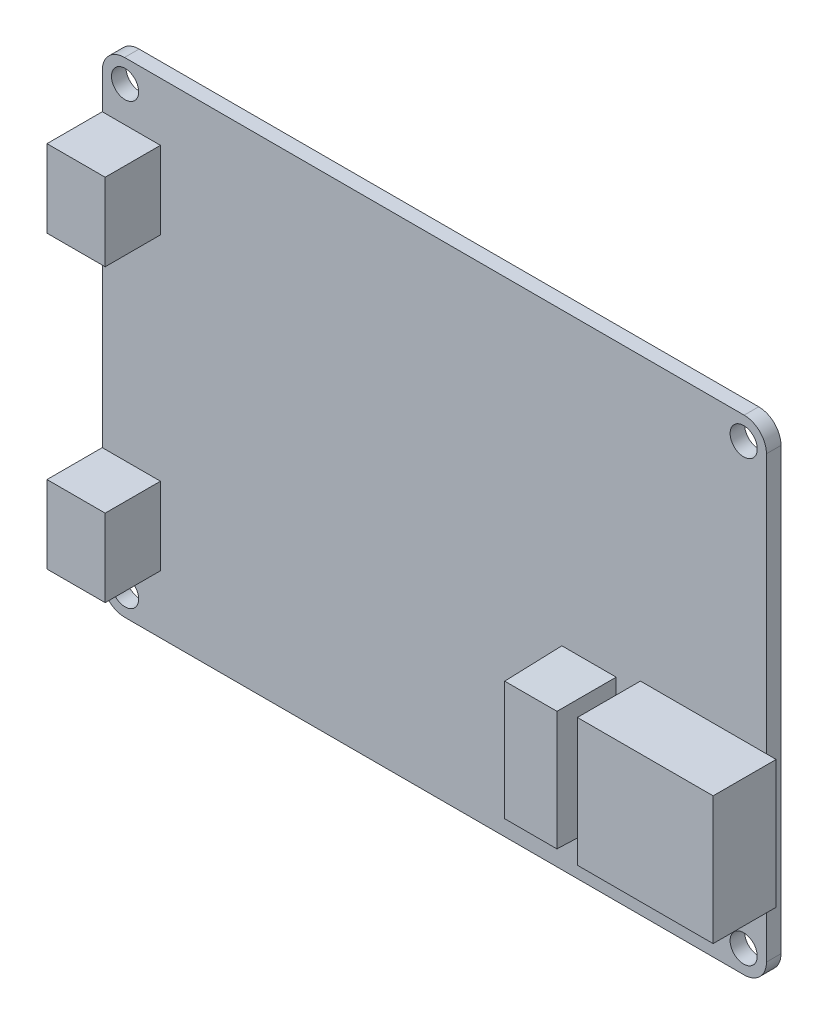
ISO-10303-21;
HEADER;
FILE_DESCRIPTION(('STEP AP214'),'2;1');
FILE_NAME('part.step','',(''),(''),'','','');
FILE_SCHEMA(('AUTOMOTIVE_DESIGN { 1 0 10303 214 1 1 1 1 }'));
ENDSEC;
DATA;
#1=APPLICATION_CONTEXT('core data for automotive mechanical design processes');
#2=APPLICATION_PROTOCOL_DEFINITION('international standard','automotive_design',2000,#1);
#3=PRODUCT_CONTEXT('',#1,'mechanical');
#4=PRODUCT('Part','Part','',(#3));
#5=PRODUCT_RELATED_PRODUCT_CATEGORY('part','',(#4));
#6=PRODUCT_DEFINITION_FORMATION('','',#4);
#7=PRODUCT_DEFINITION_CONTEXT('part definition',#1,'design');
#8=PRODUCT_DEFINITION('design','',#6,#7);
#9=PRODUCT_DEFINITION_SHAPE('','',#8);
#10=(LENGTH_UNIT() NAMED_UNIT(*) SI_UNIT(.MILLI.,.METRE.));
#11=(NAMED_UNIT(*) PLANE_ANGLE_UNIT() SI_UNIT($,.RADIAN.));
#12=(NAMED_UNIT(*) SI_UNIT($,.STERADIAN.) SOLID_ANGLE_UNIT());
#13=UNCERTAINTY_MEASURE_WITH_UNIT(LENGTH_MEASURE(1.E-05),#10,'distance_accuracy_value','');
#14=(GEOMETRIC_REPRESENTATION_CONTEXT(3) GLOBAL_UNCERTAINTY_ASSIGNED_CONTEXT((#13)) GLOBAL_UNIT_ASSIGNED_CONTEXT((#10,
#11,#12)) REPRESENTATION_CONTEXT('',''));
#15=CARTESIAN_POINT('',(0.,0.,0.));
#16=DIRECTION('',(0.,0.,1.));
#17=DIRECTION('',(1.,0.,0.));
#18=AXIS2_PLACEMENT_3D('',#15,#16,#17);
#19=CARTESIAN_POINT('',(25.8892585779876,78.6434602513933,1.5));
#20=DIRECTION('',(0.,0.,1.));
#21=DIRECTION('',(1.,0.,0.));
#22=AXIS2_PLACEMENT_3D('',#19,#20,#21);
#23=PLANE('',#22);
#24=CARTESIAN_POINT('',(89.7392585779876,33.2934602513933,1.5));
#25=DIRECTION('',(0.,0.,1.));
#26=DIRECTION('',(1.,0.,0.));
#27=AXIS2_PLACEMENT_3D('',#24,#25,#26);
#28=CIRCLE('',#27,1.4);
#29=CARTESIAN_POINT('',(91.1392585779876,33.2934602513933,1.5));
#30=VERTEX_POINT('',#29);
#31=EDGE_CURVE('E325',#30,#30,#28,.T.);
#32=ORIENTED_EDGE('',*,*,#31,.F.);
#33=EDGE_LOOP('',(#32));
#34=FACE_BOUND('',#33,.T.);
#35=CARTESIAN_POINT('',(25.9392585779876,78.5934602513933,1.5));
#36=DIRECTION('',(0.,0.,1.));
#37=DIRECTION('',(1.,0.,0.));
#38=AXIS2_PLACEMENT_3D('',#35,#36,#37);
#39=CIRCLE('',#38,1.4);
#40=CARTESIAN_POINT('',(27.3392585779876,78.5934602513933,1.5));
#41=VERTEX_POINT('',#40);
#42=EDGE_CURVE('E337',#41,#41,#39,.T.);
#43=ORIENTED_EDGE('',*,*,#42,.F.);
#44=EDGE_LOOP('',(#43));
#45=FACE_BOUND('',#44,.T.);
#46=CARTESIAN_POINT('',(25.9392585779876,33.2934602513933,1.5));
#47=DIRECTION('',(0.,0.,1.));
#48=DIRECTION('',(1.,0.,0.));
#49=AXIS2_PLACEMENT_3D('',#46,#47,#48);
#50=CIRCLE('',#49,1.4);
#51=CARTESIAN_POINT('',(27.3392585779876,33.2934602513933,1.5));
#52=VERTEX_POINT('',#51);
#53=EDGE_CURVE('E331',#52,#52,#50,.T.);
#54=ORIENTED_EDGE('',*,*,#53,.F.);
#55=EDGE_LOOP('',(#54));
#56=FACE_BOUND('',#55,.T.);
#57=CARTESIAN_POINT('',(89.7392585779876,78.5934602513933,1.5));
#58=DIRECTION('',(0.,0.,1.));
#59=DIRECTION('',(1.,0.,0.));
#60=AXIS2_PLACEMENT_3D('',#57,#58,#59);
#61=CIRCLE('',#60,1.4);
#62=CARTESIAN_POINT('',(91.1392585779876,78.5934602513933,1.5));
#63=VERTEX_POINT('',#62);
#64=EDGE_CURVE('E319',#63,#63,#61,.T.);
#65=ORIENTED_EDGE('',*,*,#64,.F.);
#66=EDGE_LOOP('',(#65));
#67=FACE_BOUND('',#66,.T.);
#68=DIRECTION('',(-1.,0.,0.));
#69=VECTOR('',#68,1.);
#70=CARTESIAN_POINT('',(76.5892585779876,50.9434602513933,1.5));
#71=LINE('',#70,#69);
#72=CARTESIAN_POINT('',(76.5892585779876,50.9434602513933,1.5));
#73=VERTEX_POINT('',#72);
#74=CARTESIAN_POINT('',(70.9892585779876,50.9434602513933,1.5));
#75=VERTEX_POINT('',#74);
#76=EDGE_CURVE('E261',#73,#75,#71,.T.);
#77=ORIENTED_EDGE('',*,*,#76,.F.);
#78=DIRECTION('',(0.,1.,0.));
#79=VECTOR('',#78,1.);
#80=CARTESIAN_POINT('',(76.5892585779876,50.9434602513933,1.5));
#81=LINE('',#80,#79);
#82=CARTESIAN_POINT('',(76.5892585779876,38.4434602513933,1.5));
#83=VERTEX_POINT('',#82);
#84=EDGE_CURVE('E258',#83,#73,#81,.T.);
#85=ORIENTED_EDGE('',*,*,#84,.F.);
#86=DIRECTION('',(1.,0.,0.));
#87=VECTOR('',#86,1.);
#88=CARTESIAN_POINT('',(76.5892585779876,38.4434602513933,1.5));
#89=LINE('',#88,#87);
#90=CARTESIAN_POINT('',(70.9892585779875,38.4434602513933,1.5));
#91=VERTEX_POINT('',#90);
#92=EDGE_CURVE('E266',#91,#83,#89,.T.);
#93=ORIENTED_EDGE('',*,*,#92,.F.);
#94=DIRECTION('',(0.,-1.,0.));
#95=VECTOR('',#94,1.);
#96=CARTESIAN_POINT('',(70.9892585779876,50.9434602513933,1.5));
#97=LINE('',#96,#95);
#98=EDGE_CURVE('E263',#75,#91,#97,.T.);
#99=ORIENTED_EDGE('',*,*,#98,.F.);
#100=EDGE_LOOP('',(#77,#85,#93,#99));
#101=FACE_BOUND('',#100,.T.);
#102=DIRECTION('',(0.,1.,0.));
#103=VECTOR('',#102,1.);
#104=CARTESIAN_POINT('',(29.5892585779876,44.9434602513933,1.5));
#105=LINE('',#104,#103);
#106=CARTESIAN_POINT('',(29.5892585779876,36.9434602513933,1.5));
#107=VERTEX_POINT('',#106);
#108=CARTESIAN_POINT('',(29.5892585779876,44.9434602513933,1.5));
#109=VERTEX_POINT('',#108);
#110=EDGE_CURVE('E49',#107,#109,#105,.T.);
#111=ORIENTED_EDGE('',*,*,#110,.F.);
#112=DIRECTION('',(1.,0.,0.));
#113=VECTOR('',#112,1.);
#114=CARTESIAN_POINT('',(23.5892585779876,36.9434602513933,1.5));
#115=LINE('',#114,#113);
#116=CARTESIAN_POINT('',(23.5892585779876,36.9434602513933,1.5));
#117=VERTEX_POINT('',#116);
#118=EDGE_CURVE('E422',#117,#107,#115,.T.);
#119=ORIENTED_EDGE('',*,*,#118,.F.);
#120=DIRECTION('',(0.,-1.,0.));
#121=VECTOR('',#120,1.);
#122=CARTESIAN_POINT('',(23.5892585779876,78.6434602513933,1.5));
#123=LINE('',#122,#121);
#124=CARTESIAN_POINT('',(23.5892585779876,33.2434602513933,1.5));
#125=VERTEX_POINT('',#124);
#126=EDGE_CURVE('E222',#117,#125,#123,.T.);
#127=ORIENTED_EDGE('',*,*,#126,.T.);
#128=CARTESIAN_POINT('',(25.8892585779876,33.2434602513933,1.5));
#129=DIRECTION('',(0.,0.,1.));
#130=DIRECTION('',(1.,0.,0.));
#131=AXIS2_PLACEMENT_3D('',#128,#129,#130);
#132=CIRCLE('',#131,2.3);
#133=CARTESIAN_POINT('',(25.8892585779876,30.9434602513933,1.5));
#134=VERTEX_POINT('',#133);
#135=EDGE_CURVE('E349',#125,#134,#132,.T.);
#136=ORIENTED_EDGE('',*,*,#135,.T.);
#137=DIRECTION('',(1.,0.,0.));
#138=VECTOR('',#137,1.);
#139=CARTESIAN_POINT('',(25.8892585779876,30.9434602513933,1.5));
#140=LINE('',#139,#138);
#141=CARTESIAN_POINT('',(89.7892585779876,30.9434602513933,1.5));
#142=VERTEX_POINT('',#141);
#143=EDGE_CURVE('E352',#134,#142,#140,.T.);
#144=ORIENTED_EDGE('',*,*,#143,.T.);
#145=CARTESIAN_POINT('',(89.7892585779876,33.2434602513933,1.5));
#146=DIRECTION('',(0.,0.,1.));
#147=DIRECTION('',(1.,0.,0.));
#148=AXIS2_PLACEMENT_3D('',#145,#146,#147);
#149=CIRCLE('',#148,2.3);
#150=CARTESIAN_POINT('',(92.0892585779876,33.2434602513933,1.5));
#151=VERTEX_POINT('',#150);
#152=EDGE_CURVE('E354',#142,#151,#149,.T.);
#153=ORIENTED_EDGE('',*,*,#152,.T.);
#154=DIRECTION('',(0.,1.,0.));
#155=VECTOR('',#154,1.);
#156=CARTESIAN_POINT('',(92.0892585779876,78.6434602513933,1.5));
#157=LINE('',#156,#155);
#158=CARTESIAN_POINT('',(92.0892585779876,38.6434602513933,1.5));
#159=VERTEX_POINT('',#158);
#160=EDGE_CURVE('E357',#151,#159,#157,.T.);
#161=ORIENTED_EDGE('',*,*,#160,.T.);
#162=DIRECTION('',(1.,0.,0.));
#163=VECTOR('',#162,1.);
#164=CARTESIAN_POINT('',(79.0892585779876,38.6434602513933,1.5));
#165=LINE('',#164,#163);
#166=CARTESIAN_POINT('',(79.0892585779876,38.6434602513933,1.5));
#167=VERTEX_POINT('',#166);
#168=EDGE_CURVE('E301',#167,#159,#165,.T.);
#169=ORIENTED_EDGE('',*,*,#168,.F.);
#170=DIRECTION('',(0.,-1.,0.));
#171=VECTOR('',#170,1.);
#172=CARTESIAN_POINT('',(79.0892585779876,51.8434602513933,1.5));
#173=LINE('',#172,#171);
#174=CARTESIAN_POINT('',(79.0892585779876,51.8434602513933,1.5));
#175=VERTEX_POINT('',#174);
#176=EDGE_CURVE('E271',#175,#167,#173,.T.);
#177=ORIENTED_EDGE('',*,*,#176,.F.);
#178=DIRECTION('',(-1.,0.,0.));
#179=VECTOR('',#178,1.);
#180=CARTESIAN_POINT('',(79.0892585779876,51.8434602513933,1.5));
#181=LINE('',#180,#179);
#182=CARTESIAN_POINT('',(92.0892585779876,51.8434602513933,1.5));
#183=VERTEX_POINT('',#182);
#184=EDGE_CURVE('E11',#183,#175,#181,.T.);
#185=ORIENTED_EDGE('',*,*,#184,.F.);
#186=CARTESIAN_POINT('',(92.0892585779876,78.6434602513933,1.5));
#187=VERTEX_POINT('',#186);
#188=EDGE_CURVE('E356',#183,#187,#157,.T.);
#189=ORIENTED_EDGE('',*,*,#188,.T.);
#190=CARTESIAN_POINT('',(89.7892585779876,78.6434602513933,1.5));
#191=DIRECTION('',(0.,0.,1.));
#192=DIRECTION('',(-1.,0.,0.));
#193=AXIS2_PLACEMENT_3D('',#190,#191,#192);
#194=CIRCLE('',#193,2.3);
#195=CARTESIAN_POINT('',(89.7892585779876,80.9434602513933,1.5));
#196=VERTEX_POINT('',#195);
#197=EDGE_CURVE('E359',#187,#196,#194,.T.);
#198=ORIENTED_EDGE('',*,*,#197,.T.);
#199=DIRECTION('',(-1.,0.,0.));
#200=VECTOR('',#199,1.);
#201=CARTESIAN_POINT('',(25.8892585779876,80.9434602513933,1.5));
#202=LINE('',#201,#200);
#203=CARTESIAN_POINT('',(25.8892585779876,80.9434602513933,1.5));
#204=VERTEX_POINT('',#203);
#205=EDGE_CURVE('E362',#196,#204,#202,.T.);
#206=ORIENTED_EDGE('',*,*,#205,.T.);
#207=CARTESIAN_POINT('',(25.8892585779876,78.6434602513933,1.5));
#208=DIRECTION('',(0.,0.,1.));
#209=DIRECTION('',(1.,0.,0.));
#210=AXIS2_PLACEMENT_3D('',#207,#208,#209);
#211=CIRCLE('',#210,2.3);
#212=CARTESIAN_POINT('',(23.5892585779876,78.6434602513933,1.5));
#213=VERTEX_POINT('',#212);
#214=EDGE_CURVE('E343',#204,#213,#211,.T.);
#215=ORIENTED_EDGE('',*,*,#214,.T.);
#216=CARTESIAN_POINT('',(23.5892585779876,74.9434602513933,1.5));
#217=VERTEX_POINT('',#216);
#218=EDGE_CURVE('E347',#213,#217,#123,.T.);
#219=ORIENTED_EDGE('',*,*,#218,.T.);
#220=DIRECTION('',(-1.,0.,0.));
#221=VECTOR('',#220,1.);
#222=CARTESIAN_POINT('',(23.5892585779876,74.9434602513933,1.5));
#223=LINE('',#222,#221);
#224=CARTESIAN_POINT('',(29.5892585779876,74.9434602513933,1.5));
#225=VERTEX_POINT('',#224);
#226=EDGE_CURVE('E236',#225,#217,#223,.T.);
#227=ORIENTED_EDGE('',*,*,#226,.F.);
#228=DIRECTION('',(0.,1.,0.));
#229=VECTOR('',#228,1.);
#230=CARTESIAN_POINT('',(29.5892585779876,74.9434602513933,1.5));
#231=LINE('',#230,#229);
#232=CARTESIAN_POINT('',(29.5892585779876,66.9434602513933,1.5));
#233=VERTEX_POINT('',#232);
#234=EDGE_CURVE('E226',#233,#225,#231,.T.);
#235=ORIENTED_EDGE('',*,*,#234,.F.);
#236=DIRECTION('',(1.,0.,0.));
#237=VECTOR('',#236,1.);
#238=CARTESIAN_POINT('',(23.5892585779876,66.9434602513933,1.5));
#239=LINE('',#238,#237);
#240=CARTESIAN_POINT('',(23.5892585779876,66.9434602513933,1.5));
#241=VERTEX_POINT('',#240);
#242=EDGE_CURVE('E223',#241,#233,#239,.T.);
#243=ORIENTED_EDGE('',*,*,#242,.F.);
#244=CARTESIAN_POINT('',(23.5892585779876,44.9434602513933,1.5));
#245=VERTEX_POINT('',#244);
#246=EDGE_CURVE('E350',#241,#245,#123,.T.);
#247=ORIENTED_EDGE('',*,*,#246,.T.);
#248=DIRECTION('',(-1.,0.,0.));
#249=VECTOR('',#248,1.);
#250=CARTESIAN_POINT('',(23.5892585779876,44.9434602513933,1.5));
#251=LINE('',#250,#249);
#252=EDGE_CURVE('E54',#109,#245,#251,.T.);
#253=ORIENTED_EDGE('',*,*,#252,.F.);
#254=EDGE_LOOP('',(#111,#119,#127,#136,#144,#153,#161,#169,#177,#185,#189,#198,#206,#215,#219,
#227,#235,#243,#247,#253));
#255=FACE_BOUND('',#254,.T.);
#256=ADVANCED_FACE('F32',(#34,#45,#56,#67,#101,#255),#23,.T.);
#257=CARTESIAN_POINT('',(25.8892585779876,78.6434602513933,0.));
#258=DIRECTION('',(0.,0.,1.));
#259=DIRECTION('',(1.,0.,0.));
#260=AXIS2_PLACEMENT_3D('',#257,#258,#259);
#261=PLANE('',#260);
#262=CARTESIAN_POINT('',(25.8892585779876,78.6434602513933,0.));
#263=DIRECTION('',(0.,0.,1.));
#264=DIRECTION('',(1.,0.,0.));
#265=AXIS2_PLACEMENT_3D('',#262,#263,#264);
#266=CIRCLE('',#265,2.3);
#267=CARTESIAN_POINT('',(25.8892585779876,80.9434602513933,0.));
#268=VERTEX_POINT('',#267);
#269=CARTESIAN_POINT('',(23.5892585779876,78.6434602513933,0.));
#270=VERTEX_POINT('',#269);
#271=EDGE_CURVE('E340',#268,#270,#266,.T.);
#272=ORIENTED_EDGE('',*,*,#271,.F.);
#273=DIRECTION('',(-1.,0.,0.));
#274=VECTOR('',#273,1.);
#275=CARTESIAN_POINT('',(25.8892585779876,80.9434602513933,0.));
#276=LINE('',#275,#274);
#277=CARTESIAN_POINT('',(89.7892585779876,80.9434602513933,0.));
#278=VERTEX_POINT('',#277);
#279=EDGE_CURVE('E346',#278,#268,#276,.T.);
#280=ORIENTED_EDGE('',*,*,#279,.F.);
#281=CARTESIAN_POINT('',(89.7892585779876,78.6434602513933,0.));
#282=DIRECTION('',(0.,0.,1.));
#283=DIRECTION('',(-1.,0.,0.));
#284=AXIS2_PLACEMENT_3D('',#281,#282,#283);
#285=CIRCLE('',#284,2.3);
#286=CARTESIAN_POINT('',(92.0892585779876,78.6434602513933,0.));
#287=VERTEX_POINT('',#286);
#288=EDGE_CURVE('E377',#287,#278,#285,.T.);
#289=ORIENTED_EDGE('',*,*,#288,.F.);
#290=DIRECTION('',(0.,1.,0.));
#291=VECTOR('',#290,1.);
#292=CARTESIAN_POINT('',(92.0892585779876,78.6434602513933,0.));
#293=LINE('',#292,#291);
#294=CARTESIAN_POINT('',(92.0892585779876,33.2434602513933,0.));
#295=VERTEX_POINT('',#294);
#296=EDGE_CURVE('E375',#295,#287,#293,.T.);
#297=ORIENTED_EDGE('',*,*,#296,.F.);
#298=CARTESIAN_POINT('',(89.7892585779876,33.2434602513933,0.));
#299=DIRECTION('',(0.,0.,1.));
#300=DIRECTION('',(1.,0.,0.));
#301=AXIS2_PLACEMENT_3D('',#298,#299,#300);
#302=CIRCLE('',#301,2.3);
#303=CARTESIAN_POINT('',(89.7892585779876,30.9434602513933,0.));
#304=VERTEX_POINT('',#303);
#305=EDGE_CURVE('E373',#304,#295,#302,.T.);
#306=ORIENTED_EDGE('',*,*,#305,.F.);
#307=DIRECTION('',(1.,0.,0.));
#308=VECTOR('',#307,1.);
#309=CARTESIAN_POINT('',(25.8892585779876,30.9434602513933,0.));
#310=LINE('',#309,#308);
#311=CARTESIAN_POINT('',(25.8892585779876,30.9434602513933,0.));
#312=VERTEX_POINT('',#311);
#313=EDGE_CURVE('E371',#312,#304,#310,.T.);
#314=ORIENTED_EDGE('',*,*,#313,.F.);
#315=CARTESIAN_POINT('',(25.8892585779876,33.2434602513933,0.));
#316=DIRECTION('',(0.,0.,1.));
#317=DIRECTION('',(1.,0.,0.));
#318=AXIS2_PLACEMENT_3D('',#315,#316,#317);
#319=CIRCLE('',#318,2.3);
#320=CARTESIAN_POINT('',(23.5892585779876,33.2434602513933,0.));
#321=VERTEX_POINT('',#320);
#322=EDGE_CURVE('E369',#321,#312,#319,.T.);
#323=ORIENTED_EDGE('',*,*,#322,.F.);
#324=DIRECTION('',(0.,-1.,0.));
#325=VECTOR('',#324,1.);
#326=CARTESIAN_POINT('',(23.5892585779876,78.6434602513933,0.));
#327=LINE('',#326,#325);
#328=EDGE_CURVE('E367',#270,#321,#327,.T.);
#329=ORIENTED_EDGE('',*,*,#328,.F.);
#330=EDGE_LOOP('',(#272,#280,#289,#297,#306,#314,#323,#329));
#331=FACE_BOUND('',#330,.T.);
#332=CARTESIAN_POINT('',(25.9392585779876,78.5934602513933,0.));
#333=DIRECTION('',(0.,0.,1.));
#334=DIRECTION('',(1.,0.,0.));
#335=AXIS2_PLACEMENT_3D('',#332,#333,#334);
#336=CIRCLE('',#335,1.4);
#337=CARTESIAN_POINT('',(27.3392585779876,78.5934602513933,0.));
#338=VERTEX_POINT('',#337);
#339=EDGE_CURVE('E334',#338,#338,#336,.T.);
#340=ORIENTED_EDGE('',*,*,#339,.T.);
#341=EDGE_LOOP('',(#340));
#342=FACE_BOUND('',#341,.T.);
#343=CARTESIAN_POINT('',(25.9392585779876,33.2934602513933,0.));
#344=DIRECTION('',(0.,0.,1.));
#345=DIRECTION('',(1.,0.,0.));
#346=AXIS2_PLACEMENT_3D('',#343,#344,#345);
#347=CIRCLE('',#346,1.4);
#348=CARTESIAN_POINT('',(27.3392585779876,33.2934602513933,0.));
#349=VERTEX_POINT('',#348);
#350=EDGE_CURVE('E328',#349,#349,#347,.T.);
#351=ORIENTED_EDGE('',*,*,#350,.T.);
#352=EDGE_LOOP('',(#351));
#353=FACE_BOUND('',#352,.T.);
#354=CARTESIAN_POINT('',(89.7392585779876,33.2934602513933,0.));
#355=DIRECTION('',(0.,0.,1.));
#356=DIRECTION('',(1.,0.,0.));
#357=AXIS2_PLACEMENT_3D('',#354,#355,#356);
#358=CIRCLE('',#357,1.4);
#359=CARTESIAN_POINT('',(91.1392585779876,33.2934602513933,0.));
#360=VERTEX_POINT('',#359);
#361=EDGE_CURVE('E322',#360,#360,#358,.T.);
#362=ORIENTED_EDGE('',*,*,#361,.T.);
#363=EDGE_LOOP('',(#362));
#364=FACE_BOUND('',#363,.T.);
#365=CARTESIAN_POINT('',(89.7392585779876,78.5934602513933,0.));
#366=DIRECTION('',(0.,0.,1.));
#367=DIRECTION('',(1.,0.,0.));
#368=AXIS2_PLACEMENT_3D('',#365,#366,#367);
#369=CIRCLE('',#368,1.4);
#370=CARTESIAN_POINT('',(91.1392585779876,78.5934602513933,0.));
#371=VERTEX_POINT('',#370);
#372=EDGE_CURVE('E318',#371,#371,#369,.T.);
#373=ORIENTED_EDGE('',*,*,#372,.T.);
#374=EDGE_LOOP('',(#373));
#375=FACE_BOUND('',#374,.T.);
#376=ADVANCED_FACE('F409',(#331,#342,#353,#364,#375),#261,.F.);
#377=CARTESIAN_POINT('',(25.8892585779876,78.6434602513933,1.5));
#378=DIRECTION('',(0.,0.,-1.));
#379=DIRECTION('',(-1.,0.,0.));
#380=AXIS2_PLACEMENT_3D('',#377,#378,#379);
#381=CYLINDRICAL_SURFACE('',#380,2.3);
#382=ORIENTED_EDGE('',*,*,#271,.T.);
#383=DIRECTION('',(0.,0.,-1.));
#384=VECTOR('',#383,1.);
#385=CARTESIAN_POINT('',(23.5892585779876,78.6434602513933,1.5));
#386=LINE('',#385,#384);
#387=EDGE_CURVE('E36',#213,#270,#386,.T.);
#388=ORIENTED_EDGE('',*,*,#387,.F.);
#389=ORIENTED_EDGE('',*,*,#214,.F.);
#390=DIRECTION('',(0.,0.,-1.));
#391=VECTOR('',#390,1.);
#392=CARTESIAN_POINT('',(25.8892585779876,80.9434602513933,1.5));
#393=LINE('',#392,#391);
#394=EDGE_CURVE('E364',#204,#268,#393,.T.);
#395=ORIENTED_EDGE('',*,*,#394,.T.);
#396=EDGE_LOOP('',(#382,#388,#389,#395));
#397=FACE_BOUND('',#396,.T.);
#398=ADVANCED_FACE('F34',(#397),#381,.T.);
#399=CARTESIAN_POINT('',(23.5892585779876,78.6434602513933,1.5));
#400=DIRECTION('',(1.,0.,0.));
#401=DIRECTION('',(0.,1.,0.));
#402=AXIS2_PLACEMENT_3D('',#399,#400,#401);
#403=PLANE('',#402);
#404=ORIENTED_EDGE('',*,*,#328,.T.);
#405=DIRECTION('',(0.,0.,-1.));
#406=VECTOR('',#405,1.);
#407=CARTESIAN_POINT('',(23.5892585779876,33.2434602513933,1.5));
#408=LINE('',#407,#406);
#409=EDGE_CURVE('E396',#125,#321,#408,.T.);
#410=ORIENTED_EDGE('',*,*,#409,.F.);
#411=ORIENTED_EDGE('',*,*,#126,.F.);
#412=DIRECTION('',(0.,0.,-1.));
#413=VECTOR('',#412,1.);
#414=CARTESIAN_POINT('',(23.5892585779876,36.9434602513933,7.2));
#415=LINE('',#414,#413);
#416=CARTESIAN_POINT('',(23.5892585779876,36.9434602513933,7.2));
#417=VERTEX_POINT('',#416);
#418=EDGE_CURVE('E204',#417,#117,#415,.T.);
#419=ORIENTED_EDGE('',*,*,#418,.F.);
#420=DIRECTION('',(0.,-1.,0.));
#421=VECTOR('',#420,1.);
#422=CARTESIAN_POINT('',(23.5892585779876,44.9434602513933,7.2));
#423=LINE('',#422,#421);
#424=CARTESIAN_POINT('',(23.5892585779876,44.9434602513933,7.2));
#425=VERTEX_POINT('',#424);
#426=EDGE_CURVE('E210',#425,#417,#423,.T.);
#427=ORIENTED_EDGE('',*,*,#426,.F.);
#428=DIRECTION('',(0.,0.,-1.));
#429=VECTOR('',#428,1.);
#430=CARTESIAN_POINT('',(23.5892585779876,44.9434602513933,7.2));
#431=LINE('',#430,#429);
#432=EDGE_CURVE('E428',#425,#245,#431,.T.);
#433=ORIENTED_EDGE('',*,*,#432,.T.);
#434=ORIENTED_EDGE('',*,*,#246,.F.);
#435=DIRECTION('',(0.,0.,-1.));
#436=VECTOR('',#435,1.);
#437=CARTESIAN_POINT('',(23.5892585779876,66.9434602513933,7.2));
#438=LINE('',#437,#436);
#439=CARTESIAN_POINT('',(23.5892585779876,66.9434602513933,7.2));
#440=VERTEX_POINT('',#439);
#441=EDGE_CURVE('E255',#440,#241,#438,.T.);
#442=ORIENTED_EDGE('',*,*,#441,.F.);
#443=DIRECTION('',(0.,-1.,0.));
#444=VECTOR('',#443,1.);
#445=CARTESIAN_POINT('',(23.5892585779876,74.9434602513933,7.2));
#446=LINE('',#445,#444);
#447=CARTESIAN_POINT('',(23.5892585779876,74.9434602513933,7.2));
#448=VERTEX_POINT('',#447);
#449=EDGE_CURVE('E232',#448,#440,#446,.T.);
#450=ORIENTED_EDGE('',*,*,#449,.F.);
#451=DIRECTION('',(0.,0.,-1.));
#452=VECTOR('',#451,1.);
#453=CARTESIAN_POINT('',(23.5892585779876,74.9434602513933,7.2));
#454=LINE('',#453,#452);
#455=EDGE_CURVE('E241',#448,#217,#454,.T.);
#456=ORIENTED_EDGE('',*,*,#455,.T.);
#457=ORIENTED_EDGE('',*,*,#218,.F.);
#458=ORIENTED_EDGE('',*,*,#387,.T.);
#459=EDGE_LOOP('',(#404,#410,#411,#419,#427,#433,#434,#442,#450,#456,#457,#458));
#460=FACE_BOUND('',#459,.T.);
#461=ADVANCED_FACE('F220',(#460),#403,.F.);
#462=CARTESIAN_POINT('',(25.8892585779876,33.2434602513933,1.5));
#463=DIRECTION('',(0.,0.,-1.));
#464=DIRECTION('',(-1.,0.,0.));
#465=AXIS2_PLACEMENT_3D('',#462,#463,#464);
#466=CYLINDRICAL_SURFACE('',#465,2.3);
#467=ORIENTED_EDGE('',*,*,#322,.T.);
#468=DIRECTION('',(0.,0.,-1.));
#469=VECTOR('',#468,1.);
#470=CARTESIAN_POINT('',(25.8892585779876,30.9434602513933,1.5));
#471=LINE('',#470,#469);
#472=EDGE_CURVE('E394',#134,#312,#471,.T.);
#473=ORIENTED_EDGE('',*,*,#472,.F.);
#474=ORIENTED_EDGE('',*,*,#135,.F.);
#475=ORIENTED_EDGE('',*,*,#409,.T.);
#476=EDGE_LOOP('',(#467,#473,#474,#475));
#477=FACE_BOUND('',#476,.T.);
#478=ADVANCED_FACE('F415',(#477),#466,.T.);
#479=CARTESIAN_POINT('',(25.8892585779876,30.9434602513933,1.5));
#480=DIRECTION('',(0.,1.,0.));
#481=DIRECTION('',(0.,0.,1.));
#482=AXIS2_PLACEMENT_3D('',#479,#480,#481);
#483=PLANE('',#482);
#484=ORIENTED_EDGE('',*,*,#313,.T.);
#485=DIRECTION('',(0.,0.,-1.));
#486=VECTOR('',#485,1.);
#487=CARTESIAN_POINT('',(89.7892585779876,30.9434602513933,1.5));
#488=LINE('',#487,#486);
#489=EDGE_CURVE('E391',#142,#304,#488,.T.);
#490=ORIENTED_EDGE('',*,*,#489,.F.);
#491=ORIENTED_EDGE('',*,*,#143,.F.);
#492=ORIENTED_EDGE('',*,*,#472,.T.);
#493=EDGE_LOOP('',(#484,#490,#491,#492));
#494=FACE_BOUND('',#493,.T.);
#495=ADVANCED_FACE('F418',(#494),#483,.F.);
#496=CARTESIAN_POINT('',(89.7892585779876,33.2434602513933,1.5));
#497=DIRECTION('',(0.,0.,-1.));
#498=DIRECTION('',(-1.,0.,0.));
#499=AXIS2_PLACEMENT_3D('',#496,#497,#498);
#500=CYLINDRICAL_SURFACE('',#499,2.3);
#501=ORIENTED_EDGE('',*,*,#305,.T.);
#502=DIRECTION('',(0.,0.,-1.));
#503=VECTOR('',#502,1.);
#504=CARTESIAN_POINT('',(92.0892585779876,33.2434602513933,1.5));
#505=LINE('',#504,#503);
#506=EDGE_CURVE('E388',#151,#295,#505,.T.);
#507=ORIENTED_EDGE('',*,*,#506,.F.);
#508=ORIENTED_EDGE('',*,*,#152,.F.);
#509=ORIENTED_EDGE('',*,*,#489,.T.);
#510=EDGE_LOOP('',(#501,#507,#508,#509));
#511=FACE_BOUND('',#510,.T.);
#512=ADVANCED_FACE('F471',(#511),#500,.T.);
#513=CARTESIAN_POINT('',(92.0892585779876,78.6434602513933,1.5));
#514=DIRECTION('',(-1.,0.,0.));
#515=DIRECTION('',(0.,0.,1.));
#516=AXIS2_PLACEMENT_3D('',#513,#514,#515);
#517=PLANE('',#516);
#518=ORIENTED_EDGE('',*,*,#296,.T.);
#519=DIRECTION('',(0.,0.,-1.));
#520=VECTOR('',#519,1.);
#521=CARTESIAN_POINT('',(92.0892585779876,78.6434602513933,1.5));
#522=LINE('',#521,#520);
#523=EDGE_CURVE('E385',#187,#287,#522,.T.);
#524=ORIENTED_EDGE('',*,*,#523,.F.);
#525=ORIENTED_EDGE('',*,*,#188,.F.);
#526=EDGE_CURVE('E360',#159,#183,#157,.T.);
#527=ORIENTED_EDGE('',*,*,#526,.F.);
#528=ORIENTED_EDGE('',*,*,#160,.F.);
#529=ORIENTED_EDGE('',*,*,#506,.T.);
#530=EDGE_LOOP('',(#518,#524,#525,#527,#528,#529));
#531=FACE_BOUND('',#530,.T.);
#532=ADVANCED_FACE('F467',(#531),#517,.F.);
#533=CARTESIAN_POINT('',(89.7892585779876,78.6434602513933,1.5));
#534=DIRECTION('',(0.,0.,-1.));
#535=DIRECTION('',(-1.,0.,0.));
#536=AXIS2_PLACEMENT_3D('',#533,#534,#535);
#537=CYLINDRICAL_SURFACE('',#536,2.3);
#538=ORIENTED_EDGE('',*,*,#288,.T.);
#539=DIRECTION('',(0.,0.,-1.));
#540=VECTOR('',#539,1.);
#541=CARTESIAN_POINT('',(89.7892585779876,80.9434602513933,1.5));
#542=LINE('',#541,#540);
#543=EDGE_CURVE('E382',#196,#278,#542,.T.);
#544=ORIENTED_EDGE('',*,*,#543,.F.);
#545=ORIENTED_EDGE('',*,*,#197,.F.);
#546=ORIENTED_EDGE('',*,*,#523,.T.);
#547=EDGE_LOOP('',(#538,#544,#545,#546));
#548=FACE_BOUND('',#547,.T.);
#549=ADVANCED_FACE('F463',(#548),#537,.T.);
#550=CARTESIAN_POINT('',(25.8892585779876,80.9434602513933,1.5));
#551=DIRECTION('',(0.,-1.,0.));
#552=DIRECTION('',(0.,0.,-1.));
#553=AXIS2_PLACEMENT_3D('',#550,#551,#552);
#554=PLANE('',#553);
#555=ORIENTED_EDGE('',*,*,#279,.T.);
#556=ORIENTED_EDGE('',*,*,#394,.F.);
#557=ORIENTED_EDGE('',*,*,#205,.F.);
#558=ORIENTED_EDGE('',*,*,#543,.T.);
#559=EDGE_LOOP('',(#555,#556,#557,#558));
#560=FACE_BOUND('',#559,.T.);
#561=ADVANCED_FACE('F460',(#560),#554,.F.);
#562=CARTESIAN_POINT('',(25.9392585779876,78.5934602513933,1.5));
#563=DIRECTION('',(0.,0.,-1.));
#564=DIRECTION('',(-1.,0.,0.));
#565=AXIS2_PLACEMENT_3D('',#562,#563,#564);
#566=CYLINDRICAL_SURFACE('',#565,1.4);
#567=ORIENTED_EDGE('',*,*,#42,.T.);
#568=EDGE_LOOP('',(#567));
#569=FACE_BOUND('',#568,.T.);
#570=ORIENTED_EDGE('',*,*,#339,.F.);
#571=EDGE_LOOP('',(#570));
#572=FACE_BOUND('',#571,.T.);
#573=ADVANCED_FACE('F457',(#569,#572),#566,.F.);
#574=CARTESIAN_POINT('',(25.9392585779876,33.2934602513933,1.5));
#575=DIRECTION('',(0.,0.,-1.));
#576=DIRECTION('',(-1.,0.,0.));
#577=AXIS2_PLACEMENT_3D('',#574,#575,#576);
#578=CYLINDRICAL_SURFACE('',#577,1.4);
#579=ORIENTED_EDGE('',*,*,#53,.T.);
#580=EDGE_LOOP('',(#579));
#581=FACE_BOUND('',#580,.T.);
#582=ORIENTED_EDGE('',*,*,#350,.F.);
#583=EDGE_LOOP('',(#582));
#584=FACE_BOUND('',#583,.T.);
#585=ADVANCED_FACE('F541',(#581,#584),#578,.F.);
#586=CARTESIAN_POINT('',(89.7392585779876,33.2934602513933,1.5));
#587=DIRECTION('',(0.,0.,-1.));
#588=DIRECTION('',(-1.,0.,0.));
#589=AXIS2_PLACEMENT_3D('',#586,#587,#588);
#590=CYLINDRICAL_SURFACE('',#589,1.4);
#591=ORIENTED_EDGE('',*,*,#31,.T.);
#592=EDGE_LOOP('',(#591));
#593=FACE_BOUND('',#592,.T.);
#594=ORIENTED_EDGE('',*,*,#361,.F.);
#595=EDGE_LOOP('',(#594));
#596=FACE_BOUND('',#595,.T.);
#597=ADVANCED_FACE('F549',(#593,#596),#590,.F.);
#598=CARTESIAN_POINT('',(89.7392585779876,78.5934602513933,1.5));
#599=DIRECTION('',(0.,0.,-1.));
#600=DIRECTION('',(-1.,0.,0.));
#601=AXIS2_PLACEMENT_3D('',#598,#599,#600);
#602=CYLINDRICAL_SURFACE('',#601,1.4);
#603=ORIENTED_EDGE('',*,*,#64,.T.);
#604=EDGE_LOOP('',(#603));
#605=FACE_BOUND('',#604,.T.);
#606=ORIENTED_EDGE('',*,*,#372,.F.);
#607=EDGE_LOOP('',(#606));
#608=FACE_BOUND('',#607,.T.);
#609=ADVANCED_FACE('F557',(#605,#608),#602,.F.);
#610=CARTESIAN_POINT('',(0.,0.,1.5));
#611=DIRECTION('',(0.,0.,1.));
#612=DIRECTION('',(1.,0.,0.));
#613=AXIS2_PLACEMENT_3D('',#610,#611,#612);
#614=PLANE('',#613);
#615=CARTESIAN_POINT('',(93.0892585779876,38.6434602513933,1.5));
#616=VERTEX_POINT('',#615);
#617=EDGE_CURVE('E300',#159,#616,#165,.T.);
#618=ORIENTED_EDGE('',*,*,#617,.F.);
#619=ORIENTED_EDGE('',*,*,#526,.T.);
#620=CARTESIAN_POINT('',(93.0892585779876,51.8434602513933,1.5));
#621=VERTEX_POINT('',#620);
#622=EDGE_CURVE('E42',#621,#183,#181,.T.);
#623=ORIENTED_EDGE('',*,*,#622,.F.);
#624=DIRECTION('',(0.,1.,0.));
#625=VECTOR('',#624,1.);
#626=CARTESIAN_POINT('',(93.0892585779876,51.8434602513933,1.5));
#627=LINE('',#626,#625);
#628=EDGE_CURVE('E304',#616,#621,#627,.T.);
#629=ORIENTED_EDGE('',*,*,#628,.F.);
#630=EDGE_LOOP('',(#618,#619,#623,#629));
#631=FACE_BOUND('',#630,.T.);
#632=ADVANCED_FACE('F565',(#631),#614,.F.);
#633=CARTESIAN_POINT('',(79.0892585779876,51.8434602513933,8.));
#634=DIRECTION('',(1.,0.,0.));
#635=DIRECTION('',(0.,1.,0.));
#636=AXIS2_PLACEMENT_3D('',#633,#634,#635);
#637=PLANE('',#636);
#638=ORIENTED_EDGE('',*,*,#176,.T.);
#639=DIRECTION('',(0.,0.,-1.));
#640=VECTOR('',#639,1.);
#641=CARTESIAN_POINT('',(79.0892585779876,38.6434602513933,8.));
#642=LINE('',#641,#640);
#643=CARTESIAN_POINT('',(79.0892585779876,38.6434602513933,8.));
#644=VERTEX_POINT('',#643);
#645=EDGE_CURVE('E315',#644,#167,#642,.T.);
#646=ORIENTED_EDGE('',*,*,#645,.F.);
#647=DIRECTION('',(0.,-1.,0.));
#648=VECTOR('',#647,1.);
#649=CARTESIAN_POINT('',(79.0892585779876,51.8434602513933,8.));
#650=LINE('',#649,#648);
#651=CARTESIAN_POINT('',(79.0892585779876,51.8434602513933,8.));
#652=VERTEX_POINT('',#651);
#653=EDGE_CURVE('E288',#652,#644,#650,.T.);
#654=ORIENTED_EDGE('',*,*,#653,.F.);
#655=DIRECTION('',(0.,0.,-1.));
#656=VECTOR('',#655,1.);
#657=CARTESIAN_POINT('',(79.0892585779876,51.8434602513933,8.));
#658=LINE('',#657,#656);
#659=EDGE_CURVE('E297',#652,#175,#658,.T.);
#660=ORIENTED_EDGE('',*,*,#659,.T.);
#661=EDGE_LOOP('',(#638,#646,#654,#660));
#662=FACE_BOUND('',#661,.T.);
#663=ADVANCED_FACE('F573',(#662),#637,.F.);
#664=CARTESIAN_POINT('',(79.0892585779876,38.6434602513933,8.));
#665=DIRECTION('',(0.,1.,0.));
#666=DIRECTION('',(0.,0.,1.));
#667=AXIS2_PLACEMENT_3D('',#664,#665,#666);
#668=PLANE('',#667);
#669=ORIENTED_EDGE('',*,*,#168,.T.);
#670=ORIENTED_EDGE('',*,*,#617,.T.);
#671=DIRECTION('',(0.,0.,-1.));
#672=VECTOR('',#671,1.);
#673=CARTESIAN_POINT('',(93.0892585779876,38.6434602513933,8.));
#674=LINE('',#673,#672);
#675=CARTESIAN_POINT('',(93.0892585779876,38.6434602513933,8.));
#676=VERTEX_POINT('',#675);
#677=EDGE_CURVE('E312',#676,#616,#674,.T.);
#678=ORIENTED_EDGE('',*,*,#677,.F.);
#679=DIRECTION('',(1.,0.,0.));
#680=VECTOR('',#679,1.);
#681=CARTESIAN_POINT('',(79.0892585779876,38.6434602513933,8.));
#682=LINE('',#681,#680);
#683=EDGE_CURVE('E291',#644,#676,#682,.T.);
#684=ORIENTED_EDGE('',*,*,#683,.F.);
#685=ORIENTED_EDGE('',*,*,#645,.T.);
#686=EDGE_LOOP('',(#669,#670,#678,#684,#685));
#687=FACE_BOUND('',#686,.T.);
#688=ADVANCED_FACE('F582',(#687),#668,.F.);
#689=CARTESIAN_POINT('',(93.0892585779876,51.8434602513933,8.));
#690=DIRECTION('',(-1.,0.,0.));
#691=DIRECTION('',(0.,0.,1.));
#692=AXIS2_PLACEMENT_3D('',#689,#690,#691);
#693=PLANE('',#692);
#694=ORIENTED_EDGE('',*,*,#628,.T.);
#695=DIRECTION('',(0.,0.,-1.));
#696=VECTOR('',#695,1.);
#697=CARTESIAN_POINT('',(93.0892585779876,51.8434602513933,8.));
#698=LINE('',#697,#696);
#699=CARTESIAN_POINT('',(93.0892585779876,51.8434602513933,8.));
#700=VERTEX_POINT('',#699);
#701=EDGE_CURVE('E309',#700,#621,#698,.T.);
#702=ORIENTED_EDGE('',*,*,#701,.F.);
#703=DIRECTION('',(0.,1.,0.));
#704=VECTOR('',#703,1.);
#705=CARTESIAN_POINT('',(93.0892585779876,51.8434602513933,8.));
#706=LINE('',#705,#704);
#707=EDGE_CURVE('E293',#676,#700,#706,.T.);
#708=ORIENTED_EDGE('',*,*,#707,.F.);
#709=ORIENTED_EDGE('',*,*,#677,.T.);
#710=EDGE_LOOP('',(#694,#702,#708,#709));
#711=FACE_BOUND('',#710,.T.);
#712=ADVANCED_FACE('F591',(#711),#693,.F.);
#713=CARTESIAN_POINT('',(79.0892585779876,51.8434602513933,8.));
#714=DIRECTION('',(0.,-1.,0.));
#715=DIRECTION('',(0.,0.,-1.));
#716=AXIS2_PLACEMENT_3D('',#713,#714,#715);
#717=PLANE('',#716);
#718=ORIENTED_EDGE('',*,*,#622,.T.);
#719=ORIENTED_EDGE('',*,*,#184,.T.);
#720=ORIENTED_EDGE('',*,*,#659,.F.);
#721=DIRECTION('',(-1.,0.,0.));
#722=VECTOR('',#721,1.);
#723=CARTESIAN_POINT('',(79.0892585779876,51.8434602513933,8.));
#724=LINE('',#723,#722);
#725=EDGE_CURVE('E295',#700,#652,#724,.T.);
#726=ORIENTED_EDGE('',*,*,#725,.F.);
#727=ORIENTED_EDGE('',*,*,#701,.T.);
#728=EDGE_LOOP('',(#718,#719,#720,#726,#727));
#729=FACE_BOUND('',#728,.T.);
#730=ADVANCED_FACE('F600',(#729),#717,.F.);
#731=CARTESIAN_POINT('',(0.,0.,8.));
#732=DIRECTION('',(0.,0.,1.));
#733=DIRECTION('',(1.,0.,0.));
#734=AXIS2_PLACEMENT_3D('',#731,#732,#733);
#735=PLANE('',#734);
#736=ORIENTED_EDGE('',*,*,#653,.T.);
#737=ORIENTED_EDGE('',*,*,#683,.T.);
#738=ORIENTED_EDGE('',*,*,#707,.T.);
#739=ORIENTED_EDGE('',*,*,#725,.T.);
#740=EDGE_LOOP('',(#736,#737,#738,#739));
#741=FACE_BOUND('',#740,.T.);
#742=ADVANCED_FACE('F609',(#741),#735,.T.);
#743=CARTESIAN_POINT('',(76.5892585779876,50.9434602513933,1.5));
#744=DIRECTION('',(0.999847695156391,0.,0.0174524064372835));
#745=DIRECTION('',(0.0174524064372835,0.,-0.999847695156391));
#746=AXIS2_PLACEMENT_3D('',#743,#744,#745);
#747=PLANE('',#746);
#748=ORIENTED_EDGE('',*,*,#84,.T.);
#749=DIRECTION('',(0.0174497491606827,0.0174497491606827,-0.999695459881888));
#750=VECTOR('',#749,1.);
#751=CARTESIAN_POINT('',(76.5892585779876,50.9434602513933,1.5));
#752=LINE('',#751,#750);
#753=CARTESIAN_POINT('',(76.4845281884183,50.838729861824,7.5));
#754=VERTEX_POINT('',#753);
#755=EDGE_CURVE('E269',#754,#73,#752,.T.);
#756=ORIENTED_EDGE('',*,*,#755,.F.);
#757=DIRECTION('',(0.,-1.,0.));
#758=VECTOR('',#757,1.);
#759=CARTESIAN_POINT('',(76.4845281884183,0.,7.5));
#760=LINE('',#759,#758);
#761=CARTESIAN_POINT('',(76.4845281884183,38.5481906409626,7.5));
#762=VERTEX_POINT('',#761);
#763=EDGE_CURVE('E268',#762,#754,#760,.F.);
#764=ORIENTED_EDGE('',*,*,#763,.F.);
#765=DIRECTION('',(0.0174497491606827,-0.0174497491606827,-0.999695459881887));
#766=VECTOR('',#765,1.);
#767=CARTESIAN_POINT('',(76.5854524061654,38.4472664232154,1.71805543765015));
#768=LINE('',#767,#766);
#769=EDGE_CURVE('E273',#762,#83,#768,.T.);
#770=ORIENTED_EDGE('',*,*,#769,.T.);
#771=EDGE_LOOP('',(#748,#756,#764,#770));
#772=FACE_BOUND('',#771,.T.);
#773=ADVANCED_FACE('F618',(#772),#747,.T.);
#774=CARTESIAN_POINT('',(76.5892585779876,50.9434602513933,1.5));
#775=DIRECTION('',(0.,0.999847695156391,0.0174524064372835));
#776=DIRECTION('',(0.,-0.0174524064372836,0.999847695156391));
#777=AXIS2_PLACEMENT_3D('',#774,#775,#776);
#778=PLANE('',#777);
#779=ORIENTED_EDGE('',*,*,#76,.T.);
#780=DIRECTION('',(-0.0174497491606827,0.0174497491606827,-0.999695459881888));
#781=VECTOR('',#780,1.);
#782=CARTESIAN_POINT('',(70.9892585779876,50.9434602513933,1.5));
#783=LINE('',#782,#781);
#784=CARTESIAN_POINT('',(71.0939889675569,50.838729861824,7.5));
#785=VERTEX_POINT('',#784);
#786=EDGE_CURVE('E272',#785,#75,#783,.T.);
#787=ORIENTED_EDGE('',*,*,#786,.F.);
#788=DIRECTION('',(1.,0.,0.));
#789=VECTOR('',#788,1.);
#790=CARTESIAN_POINT('',(0.,50.838729861824,7.5));
#791=LINE('',#790,#789);
#792=EDGE_CURVE('E283',#754,#785,#791,.F.);
#793=ORIENTED_EDGE('',*,*,#792,.F.);
#794=ORIENTED_EDGE('',*,*,#755,.T.);
#795=EDGE_LOOP('',(#779,#787,#793,#794));
#796=FACE_BOUND('',#795,.T.);
#797=ADVANCED_FACE('F627',(#796),#778,.T.);
#798=CARTESIAN_POINT('',(70.9892585779876,50.9434602513933,1.5));
#799=DIRECTION('',(-0.999847695156391,0.,0.0174524064372835));
#800=DIRECTION('',(0.0174524064372835,0.,0.999847695156391));
#801=AXIS2_PLACEMENT_3D('',#798,#799,#800);
#802=PLANE('',#801);
#803=ORIENTED_EDGE('',*,*,#98,.T.);
#804=DIRECTION('',(-0.0174497491606827,-0.0174497491606827,-0.999695459881887));
#805=VECTOR('',#804,1.);
#806=CARTESIAN_POINT('',(70.9909637429639,38.4451654163696,1.59768883606727));
#807=LINE('',#806,#805);
#808=CARTESIAN_POINT('',(71.0939889675569,38.5481906409626,7.5));
#809=VERTEX_POINT('',#808);
#810=EDGE_CURVE('E276',#809,#91,#807,.T.);
#811=ORIENTED_EDGE('',*,*,#810,.F.);
#812=DIRECTION('',(0.,1.,0.));
#813=VECTOR('',#812,1.);
#814=CARTESIAN_POINT('',(71.0939889675568,0.,7.5));
#815=LINE('',#814,#813);
#816=EDGE_CURVE('E285',#785,#809,#815,.F.);
#817=ORIENTED_EDGE('',*,*,#816,.F.);
#818=ORIENTED_EDGE('',*,*,#786,.T.);
#819=EDGE_LOOP('',(#803,#811,#817,#818));
#820=FACE_BOUND('',#819,.T.);
#821=ADVANCED_FACE('F636',(#820),#802,.T.);
#822=CARTESIAN_POINT('',(76.5892585779876,38.4434602513933,1.5));
#823=DIRECTION('',(0.,-0.999847695156391,0.0174524064372835));
#824=DIRECTION('',(0.,-0.0174524064372835,-0.999847695156391));
#825=AXIS2_PLACEMENT_3D('',#822,#823,#824);
#826=PLANE('',#825);
#827=ORIENTED_EDGE('',*,*,#92,.T.);
#828=ORIENTED_EDGE('',*,*,#769,.F.);
#829=DIRECTION('',(-1.,0.,0.));
#830=VECTOR('',#829,1.);
#831=CARTESIAN_POINT('',(0.,38.5481906409626,7.5));
#832=LINE('',#831,#830);
#833=EDGE_CURVE('E277',#809,#762,#832,.F.);
#834=ORIENTED_EDGE('',*,*,#833,.F.);
#835=ORIENTED_EDGE('',*,*,#810,.T.);
#836=EDGE_LOOP('',(#827,#828,#834,#835));
#837=FACE_BOUND('',#836,.T.);
#838=ADVANCED_FACE('F645',(#837),#826,.T.);
#839=CARTESIAN_POINT('',(0.,0.,7.5));
#840=DIRECTION('',(0.,0.,-1.));
#841=DIRECTION('',(-1.,0.,0.));
#842=AXIS2_PLACEMENT_3D('',#839,#840,#841);
#843=PLANE('',#842);
#844=ORIENTED_EDGE('',*,*,#763,.T.);
#845=ORIENTED_EDGE('',*,*,#792,.T.);
#846=ORIENTED_EDGE('',*,*,#816,.T.);
#847=ORIENTED_EDGE('',*,*,#833,.T.);
#848=EDGE_LOOP('',(#844,#845,#846,#847));
#849=FACE_BOUND('',#848,.T.);
#850=ADVANCED_FACE('F654',(#849),#843,.F.);
#851=CARTESIAN_POINT('',(23.5892585779876,66.9434602513933,7.2));
#852=DIRECTION('',(0.,1.,0.));
#853=DIRECTION('',(0.,0.,1.));
#854=AXIS2_PLACEMENT_3D('',#851,#852,#853);
#855=PLANE('',#854);
#856=ORIENTED_EDGE('',*,*,#242,.T.);
#857=DIRECTION('',(0.,0.,-1.));
#858=VECTOR('',#857,1.);
#859=CARTESIAN_POINT('',(29.5892585779876,66.9434602513933,7.2));
#860=LINE('',#859,#858);
#861=CARTESIAN_POINT('',(29.5892585779876,66.9434602513933,7.2));
#862=VERTEX_POINT('',#861);
#863=EDGE_CURVE('E252',#862,#233,#860,.T.);
#864=ORIENTED_EDGE('',*,*,#863,.F.);
#865=DIRECTION('',(1.,0.,0.));
#866=VECTOR('',#865,1.);
#867=CARTESIAN_POINT('',(23.5892585779876,66.9434602513933,7.2));
#868=LINE('',#867,#866);
#869=EDGE_CURVE('E235',#440,#862,#868,.T.);
#870=ORIENTED_EDGE('',*,*,#869,.F.);
#871=ORIENTED_EDGE('',*,*,#441,.T.);
#872=EDGE_LOOP('',(#856,#864,#870,#871));
#873=FACE_BOUND('',#872,.T.);
#874=ADVANCED_FACE('F662',(#873),#855,.F.);
#875=CARTESIAN_POINT('',(29.5892585779876,74.9434602513933,7.2));
#876=DIRECTION('',(-1.,0.,0.));
#877=DIRECTION('',(0.,-1.,0.));
#878=AXIS2_PLACEMENT_3D('',#875,#876,#877);
#879=PLANE('',#878);
#880=ORIENTED_EDGE('',*,*,#234,.T.);
#881=DIRECTION('',(0.,0.,-1.));
#882=VECTOR('',#881,1.);
#883=CARTESIAN_POINT('',(29.5892585779876,74.9434602513933,7.2));
#884=LINE('',#883,#882);
#885=CARTESIAN_POINT('',(29.5892585779876,74.9434602513933,7.2));
#886=VERTEX_POINT('',#885);
#887=EDGE_CURVE('E249',#886,#225,#884,.T.);
#888=ORIENTED_EDGE('',*,*,#887,.F.);
#889=DIRECTION('',(0.,1.,0.));
#890=VECTOR('',#889,1.);
#891=CARTESIAN_POINT('',(29.5892585779876,74.9434602513933,7.2));
#892=LINE('',#891,#890);
#893=EDGE_CURVE('E238',#862,#886,#892,.T.);
#894=ORIENTED_EDGE('',*,*,#893,.F.);
#895=ORIENTED_EDGE('',*,*,#863,.T.);
#896=EDGE_LOOP('',(#880,#888,#894,#895));
#897=FACE_BOUND('',#896,.T.);
#898=ADVANCED_FACE('F677',(#897),#879,.F.);
#899=CARTESIAN_POINT('',(23.5892585779876,74.9434602513933,7.2));
#900=DIRECTION('',(0.,-1.,0.));
#901=DIRECTION('',(0.,0.,-1.));
#902=AXIS2_PLACEMENT_3D('',#899,#900,#901);
#903=PLANE('',#902);
#904=ORIENTED_EDGE('',*,*,#226,.T.);
#905=ORIENTED_EDGE('',*,*,#455,.F.);
#906=DIRECTION('',(-1.,0.,0.));
#907=VECTOR('',#906,1.);
#908=CARTESIAN_POINT('',(23.5892585779876,74.9434602513933,7.2));
#909=LINE('',#908,#907);
#910=EDGE_CURVE('E240',#886,#448,#909,.T.);
#911=ORIENTED_EDGE('',*,*,#910,.F.);
#912=ORIENTED_EDGE('',*,*,#887,.T.);
#913=EDGE_LOOP('',(#904,#905,#911,#912));
#914=FACE_BOUND('',#913,.T.);
#915=ADVANCED_FACE('F687',(#914),#903,.F.);
#916=CARTESIAN_POINT('',(0.,0.,7.2));
#917=DIRECTION('',(0.,0.,1.));
#918=DIRECTION('',(1.,0.,0.));
#919=AXIS2_PLACEMENT_3D('',#916,#917,#918);
#920=PLANE('',#919);
#921=ORIENTED_EDGE('',*,*,#449,.T.);
#922=ORIENTED_EDGE('',*,*,#869,.T.);
#923=ORIENTED_EDGE('',*,*,#893,.T.);
#924=ORIENTED_EDGE('',*,*,#910,.T.);
#925=EDGE_LOOP('',(#921,#922,#923,#924));
#926=FACE_BOUND('',#925,.T.);
#927=ADVANCED_FACE('F445',(#926),#920,.T.);
#928=CARTESIAN_POINT('',(23.5892585779876,36.9434602513933,7.2));
#929=DIRECTION('',(0.,1.,0.));
#930=DIRECTION('',(0.,0.,1.));
#931=AXIS2_PLACEMENT_3D('',#928,#929,#930);
#932=PLANE('',#931);
#933=ORIENTED_EDGE('',*,*,#118,.T.);
#934=DIRECTION('',(0.,0.,-1.));
#935=VECTOR('',#934,1.);
#936=CARTESIAN_POINT('',(29.5892585779876,36.9434602513933,7.2));
#937=LINE('',#936,#935);
#938=CARTESIAN_POINT('',(29.5892585779876,36.9434602513933,7.2));
#939=VERTEX_POINT('',#938);
#940=EDGE_CURVE('E206',#939,#107,#937,.T.);
#941=ORIENTED_EDGE('',*,*,#940,.F.);
#942=DIRECTION('',(1.,0.,0.));
#943=VECTOR('',#942,1.);
#944=CARTESIAN_POINT('',(23.5892585779876,36.9434602513933,7.2));
#945=LINE('',#944,#943);
#946=EDGE_CURVE('E200',#417,#939,#945,.T.);
#947=ORIENTED_EDGE('',*,*,#946,.F.);
#948=ORIENTED_EDGE('',*,*,#418,.T.);
#949=EDGE_LOOP('',(#933,#941,#947,#948));
#950=FACE_BOUND('',#949,.T.);
#951=ADVANCED_FACE('F202',(#950),#932,.F.);
#952=CARTESIAN_POINT('',(29.5892585779876,44.9434602513933,7.2));
#953=DIRECTION('',(-1.,0.,0.));
#954=DIRECTION('',(0.,-1.,0.));
#955=AXIS2_PLACEMENT_3D('',#952,#953,#954);
#956=PLANE('',#955);
#957=ORIENTED_EDGE('',*,*,#110,.T.);
#958=DIRECTION('',(0.,0.,-1.));
#959=VECTOR('',#958,1.);
#960=CARTESIAN_POINT('',(29.5892585779876,44.9434602513933,7.2));
#961=LINE('',#960,#959);
#962=CARTESIAN_POINT('',(29.5892585779876,44.9434602513933,7.2));
#963=VERTEX_POINT('',#962);
#964=EDGE_CURVE('E228',#963,#109,#961,.T.);
#965=ORIENTED_EDGE('',*,*,#964,.F.);
#966=DIRECTION('',(0.,1.,0.));
#967=VECTOR('',#966,1.);
#968=CARTESIAN_POINT('',(29.5892585779876,44.9434602513933,7.2));
#969=LINE('',#968,#967);
#970=EDGE_CURVE('E209',#939,#963,#969,.T.);
#971=ORIENTED_EDGE('',*,*,#970,.F.);
#972=ORIENTED_EDGE('',*,*,#940,.T.);
#973=EDGE_LOOP('',(#957,#965,#971,#972));
#974=FACE_BOUND('',#973,.T.);
#975=ADVANCED_FACE('F437',(#974),#956,.F.);
#976=CARTESIAN_POINT('',(23.5892585779876,44.9434602513933,7.2));
#977=DIRECTION('',(0.,-1.,0.));
#978=DIRECTION('',(1.,0.,0.));
#979=AXIS2_PLACEMENT_3D('',#976,#977,#978);
#980=PLANE('',#979);
#981=ORIENTED_EDGE('',*,*,#252,.T.);
#982=ORIENTED_EDGE('',*,*,#432,.F.);
#983=DIRECTION('',(-1.,0.,0.));
#984=VECTOR('',#983,1.);
#985=CARTESIAN_POINT('',(23.5892585779876,44.9434602513933,7.2));
#986=LINE('',#985,#984);
#987=EDGE_CURVE('E215',#963,#425,#986,.T.);
#988=ORIENTED_EDGE('',*,*,#987,.F.);
#989=ORIENTED_EDGE('',*,*,#964,.T.);
#990=EDGE_LOOP('',(#981,#982,#988,#989));
#991=FACE_BOUND('',#990,.T.);
#992=ADVANCED_FACE('F427',(#991),#980,.F.);
#993=CARTESIAN_POINT('',(0.,0.,7.2));
#994=DIRECTION('',(0.,0.,1.));
#995=DIRECTION('',(1.,0.,0.));
#996=AXIS2_PLACEMENT_3D('',#993,#994,#995);
#997=PLANE('',#996);
#998=ORIENTED_EDGE('',*,*,#426,.T.);
#999=ORIENTED_EDGE('',*,*,#946,.T.);
#1000=ORIENTED_EDGE('',*,*,#970,.T.);
#1001=ORIENTED_EDGE('',*,*,#987,.T.);
#1002=EDGE_LOOP('',(#998,#999,#1000,#1001));
#1003=FACE_BOUND('',#1002,.T.);
#1004=ADVANCED_FACE('F213',(#1003),#997,.T.);
#1005=CLOSED_SHELL('',(#256,#376,#398,#461,#478,#495,#512,#532,#549,#561,#573,#585,#597,#609,
#632,#663,#688,#712,#730,#742,#773,#797,#821,#838,#850,#874,#898,#915,#927,#951,#975,#992,#1004));
#1006=MANIFOLD_SOLID_BREP('B2',#1005);
#1007=ADVANCED_BREP_SHAPE_REPRESENTATION('',(#18,#1006),#14);
#1008=SHAPE_DEFINITION_REPRESENTATION(#9,#1007);
ENDSEC;
END-ISO-10303-21;
